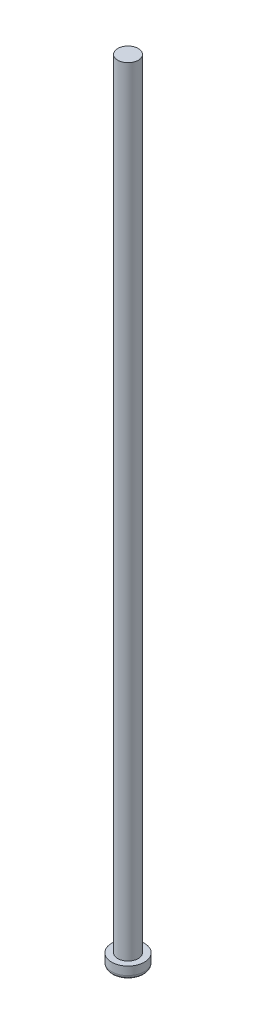
ISO-10303-21;
HEADER;
FILE_DESCRIPTION(('STEP AP214'),'2;1');
FILE_NAME('part.step','',(''),(''),'','','');
FILE_SCHEMA(('AUTOMOTIVE_DESIGN { 1 0 10303 214 1 1 1 1 }'));
ENDSEC;
DATA;
#1=APPLICATION_CONTEXT('core data for automotive mechanical design processes');
#2=APPLICATION_PROTOCOL_DEFINITION('international standard','automotive_design',2000,#1);
#3=PRODUCT_CONTEXT('',#1,'mechanical');
#4=PRODUCT('Part','Part','',(#3));
#5=PRODUCT_RELATED_PRODUCT_CATEGORY('part','',(#4));
#6=PRODUCT_DEFINITION_FORMATION('','',#4);
#7=PRODUCT_DEFINITION_CONTEXT('part definition',#1,'design');
#8=PRODUCT_DEFINITION('design','',#6,#7);
#9=PRODUCT_DEFINITION_SHAPE('','',#8);
#10=(LENGTH_UNIT() NAMED_UNIT(*) SI_UNIT(.MILLI.,.METRE.));
#11=(NAMED_UNIT(*) PLANE_ANGLE_UNIT() SI_UNIT($,.RADIAN.));
#12=(NAMED_UNIT(*) SI_UNIT($,.STERADIAN.) SOLID_ANGLE_UNIT());
#13=UNCERTAINTY_MEASURE_WITH_UNIT(LENGTH_MEASURE(1.E-05),#10,'distance_accuracy_value','');
#14=(GEOMETRIC_REPRESENTATION_CONTEXT(3) GLOBAL_UNCERTAINTY_ASSIGNED_CONTEXT((#13)) GLOBAL_UNIT_ASSIGNED_CONTEXT((#10,
#11,#12)) REPRESENTATION_CONTEXT('',''));
#15=CARTESIAN_POINT('',(0.,0.,0.));
#16=DIRECTION('',(0.,0.,1.));
#17=DIRECTION('',(1.,0.,0.));
#18=AXIS2_PLACEMENT_3D('',#15,#16,#17);
#19=CARTESIAN_POINT('',(0.,190.,0.));
#20=DIRECTION('',(0.,-1.,0.));
#21=DIRECTION('',(0.,0.,-1.));
#22=AXIS2_PLACEMENT_3D('',#19,#20,#21);
#23=CYLINDRICAL_SURFACE('',#22,2.5);
#24=CARTESIAN_POINT('',(0.,190.,0.));
#25=DIRECTION('',(0.,1.,0.));
#26=DIRECTION('',(0.,0.,1.));
#27=AXIS2_PLACEMENT_3D('',#24,#25,#26);
#28=CIRCLE('',#27,2.5);
#29=CARTESIAN_POINT('',(0.,190.,2.5));
#30=VERTEX_POINT('',#29);
#31=EDGE_CURVE('E44',#30,#30,#28,.T.);
#32=ORIENTED_EDGE('',*,*,#31,.F.);
#33=EDGE_LOOP('',(#32));
#34=FACE_BOUND('',#33,.T.);
#35=CARTESIAN_POINT('',(0.,0.,0.));
#36=DIRECTION('',(0.,-1.,0.));
#37=DIRECTION('',(0.,0.,-1.));
#38=AXIS2_PLACEMENT_3D('',#35,#36,#37);
#39=CIRCLE('',#38,2.5);
#40=CARTESIAN_POINT('',(0.,0.,-2.5));
#41=VERTEX_POINT('',#40);
#42=EDGE_CURVE('E48',#41,#41,#39,.T.);
#43=ORIENTED_EDGE('',*,*,#42,.F.);
#44=EDGE_LOOP('',(#43));
#45=FACE_BOUND('',#44,.T.);
#46=ADVANCED_FACE('F33',(#34,#45),#23,.T.);
#47=CARTESIAN_POINT('',(0.,190.,0.));
#48=DIRECTION('',(0.,1.,0.));
#49=DIRECTION('',(0.,0.,1.));
#50=AXIS2_PLACEMENT_3D('',#47,#48,#49);
#51=PLANE('',#50);
#52=ORIENTED_EDGE('',*,*,#31,.T.);
#53=EDGE_LOOP('',(#52));
#54=FACE_BOUND('',#53,.T.);
#55=ADVANCED_FACE('F62',(#54),#51,.T.);
#56=CARTESIAN_POINT('',(0.,0.,0.));
#57=DIRECTION('',(0.,-1.,0.));
#58=DIRECTION('',(0.,0.,-1.));
#59=AXIS2_PLACEMENT_3D('',#56,#57,#58);
#60=PLANE('',#59);
#61=CARTESIAN_POINT('',(0.,0.,0.));
#62=DIRECTION('',(0.,-1.,0.));
#63=DIRECTION('',(0.,0.,-1.));
#64=AXIS2_PLACEMENT_3D('',#61,#62,#63);
#65=CIRCLE('',#64,4.);
#66=CARTESIAN_POINT('',(0.,0.,-4.));
#67=VERTEX_POINT('',#66);
#68=EDGE_CURVE('E53',#67,#67,#65,.T.);
#69=ORIENTED_EDGE('',*,*,#68,.F.);
#70=EDGE_LOOP('',(#69));
#71=FACE_BOUND('',#70,.T.);
#72=ORIENTED_EDGE('',*,*,#42,.T.);
#73=EDGE_LOOP('',(#72));
#74=FACE_BOUND('',#73,.T.);
#75=ADVANCED_FACE('F59',(#71,#74),#60,.F.);
#76=CARTESIAN_POINT('',(0.,-3.,0.));
#77=DIRECTION('',(0.,1.,0.));
#78=DIRECTION('',(0.,0.,1.));
#79=AXIS2_PLACEMENT_3D('',#76,#77,#78);
#80=CYLINDRICAL_SURFACE('',#79,4.);
#81=CARTESIAN_POINT('',(0.,-2.,0.));
#82=DIRECTION('',(0.,-1.,0.));
#83=DIRECTION('',(0.,0.,-1.));
#84=AXIS2_PLACEMENT_3D('',#81,#82,#83);
#85=CIRCLE('',#84,4.);
#86=CARTESIAN_POINT('',(0.,-2.,-4.));
#87=VERTEX_POINT('',#86);
#88=EDGE_CURVE('E10',#87,#87,#85,.F.);
#89=ORIENTED_EDGE('',*,*,#88,.T.);
#90=EDGE_LOOP('',(#89));
#91=FACE_BOUND('',#90,.T.);
#92=ORIENTED_EDGE('',*,*,#68,.T.);
#93=EDGE_LOOP('',(#92));
#94=FACE_BOUND('',#93,.T.);
#95=ADVANCED_FACE('F57',(#91,#94),#80,.T.);
#96=CARTESIAN_POINT('',(0.,-3.,0.));
#97=DIRECTION('',(0.,-1.,0.));
#98=DIRECTION('',(0.,0.,-1.));
#99=AXIS2_PLACEMENT_3D('',#96,#97,#98);
#100=PLANE('',#99);
#101=CARTESIAN_POINT('',(0.,-3.,0.));
#102=DIRECTION('',(0.,-1.,0.));
#103=DIRECTION('',(0.,0.,-1.));
#104=AXIS2_PLACEMENT_3D('',#101,#102,#103);
#105=CIRCLE('',#104,3.);
#106=CARTESIAN_POINT('',(0.,-3.,-3.));
#107=VERTEX_POINT('',#106);
#108=EDGE_CURVE('E40',#107,#107,#105,.T.);
#109=ORIENTED_EDGE('',*,*,#108,.T.);
#110=EDGE_LOOP('',(#109));
#111=FACE_BOUND('',#110,.T.);
#112=ADVANCED_FACE('F76',(#111),#100,.T.);
#113=CARTESIAN_POINT('',(0.,-2.,0.));
#114=DIRECTION('',(0.,-1.,0.));
#115=DIRECTION('',(0.,0.,-1.));
#116=AXIS2_PLACEMENT_3D('',#113,#114,#115);
#117=TOROIDAL_SURFACE('',#116,3.,1.);
#118=ORIENTED_EDGE('',*,*,#88,.F.);
#119=EDGE_LOOP('',(#118));
#120=FACE_BOUND('',#119,.T.);
#121=ORIENTED_EDGE('',*,*,#108,.F.);
#122=EDGE_LOOP('',(#121));
#123=FACE_BOUND('',#122,.T.);
#124=ADVANCED_FACE('F35',(#120,#123),#117,.T.);
#125=CLOSED_SHELL('',(#46,#55,#75,#95,#112,#124));
#126=MANIFOLD_SOLID_BREP('B2',#125);
#127=ADVANCED_BREP_SHAPE_REPRESENTATION('',(#18,#126),#14);
#128=SHAPE_DEFINITION_REPRESENTATION(#9,#127);
ENDSEC;
END-ISO-10303-21;
